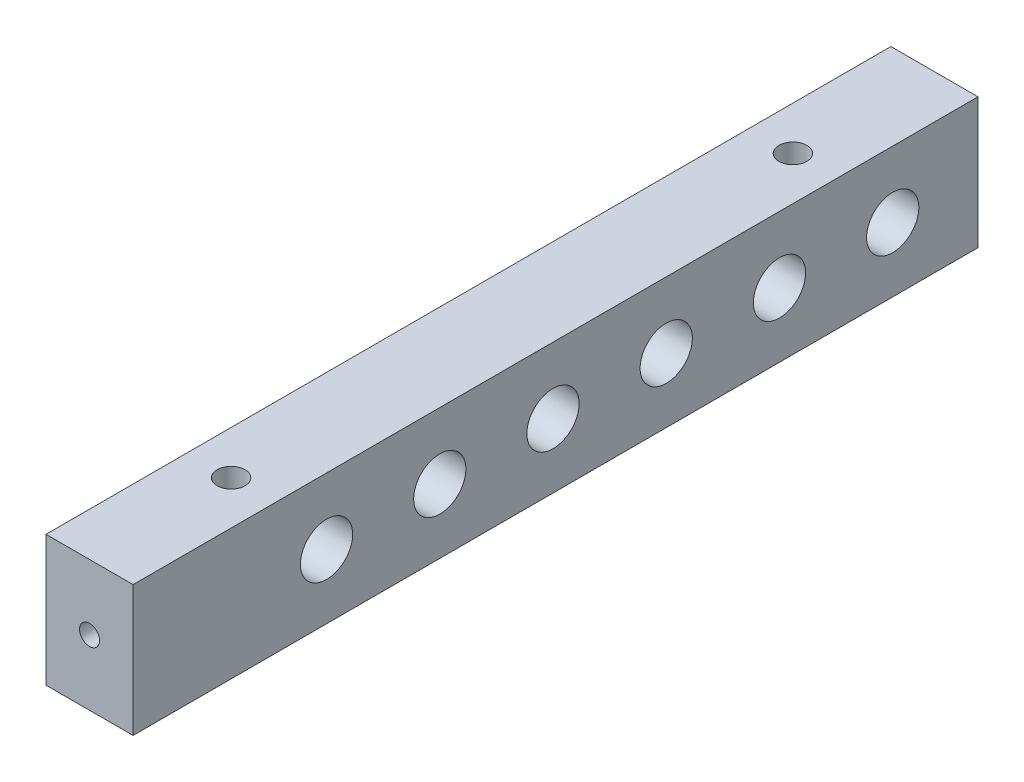
ISO-10303-21;
HEADER;
FILE_DESCRIPTION(('STEP AP214'),'2;1');
FILE_NAME('part.step','',(''),(''),'','','');
FILE_SCHEMA(('AUTOMOTIVE_DESIGN { 1 0 10303 214 1 1 1 1 }'));
ENDSEC;
DATA;
#1=APPLICATION_CONTEXT('core data for automotive mechanical design processes');
#2=APPLICATION_PROTOCOL_DEFINITION('international standard','automotive_design',2000,#1);
#3=PRODUCT_CONTEXT('',#1,'mechanical');
#4=PRODUCT('Part','Part','',(#3));
#5=PRODUCT_RELATED_PRODUCT_CATEGORY('part','',(#4));
#6=PRODUCT_DEFINITION_FORMATION('','',#4);
#7=PRODUCT_DEFINITION_CONTEXT('part definition',#1,'design');
#8=PRODUCT_DEFINITION('design','',#6,#7);
#9=PRODUCT_DEFINITION_SHAPE('','',#8);
#10=(LENGTH_UNIT() NAMED_UNIT(*) SI_UNIT(.MILLI.,.METRE.));
#11=(NAMED_UNIT(*) PLANE_ANGLE_UNIT() SI_UNIT($,.RADIAN.));
#12=(NAMED_UNIT(*) SI_UNIT($,.STERADIAN.) SOLID_ANGLE_UNIT());
#13=UNCERTAINTY_MEASURE_WITH_UNIT(LENGTH_MEASURE(1.E-05),#10,'distance_accuracy_value','');
#14=(GEOMETRIC_REPRESENTATION_CONTEXT(3) GLOBAL_UNCERTAINTY_ASSIGNED_CONTEXT((#13)) GLOBAL_UNIT_ASSIGNED_CONTEXT((#10,
#11,#12)) REPRESENTATION_CONTEXT('',''));
#15=CARTESIAN_POINT('',(0.,0.,0.));
#16=DIRECTION('',(0.,0.,1.));
#17=DIRECTION('',(1.,0.,0.));
#18=AXIS2_PLACEMENT_3D('',#15,#16,#17);
#19=CARTESIAN_POINT('',(5.34883720934921,-6.77325581395348,33.7500000001497));
#20=DIRECTION('',(0.,1.,0.));
#21=DIRECTION('',(0.,0.,1.));
#22=AXIS2_PLACEMENT_3D('',#19,#20,#21);
#23=CYLINDRICAL_SURFACE('',#22,1.6);
#24=CARTESIAN_POINT('',(5.34883720934921,8.22674418604652,33.7500000001497));
#25=DIRECTION('',(0.,1.,0.));
#26=DIRECTION('',(0.,0.,1.));
#27=AXIS2_PLACEMENT_3D('',#24,#25,#26);
#28=CIRCLE('',#27,1.6);
#29=CARTESIAN_POINT('',(5.34883720934921,8.22674418604652,35.3500000001497));
#30=VERTEX_POINT('',#29);
#31=EDGE_CURVE('E101',#30,#30,#28,.T.);
#32=ORIENTED_EDGE('',*,*,#31,.T.);
#33=EDGE_LOOP('',(#32));
#34=FACE_BOUND('',#33,.T.);
#35=CARTESIAN_POINT('',(5.34883720934921,-3.77325581395348,33.7500000001497));
#36=DIRECTION('',(0.,-1.,0.));
#37=DIRECTION('',(0.,0.,-1.));
#38=AXIS2_PLACEMENT_3D('',#35,#36,#37);
#39=CIRCLE('',#38,1.6);
#40=CARTESIAN_POINT('',(5.34883720934921,-3.77325581395348,32.1500000001497));
#41=VERTEX_POINT('',#40);
#42=EDGE_CURVE('E40',#41,#41,#39,.F.);
#43=ORIENTED_EDGE('',*,*,#42,.F.);
#44=EDGE_LOOP('',(#43));
#45=FACE_BOUND('',#44,.T.);
#46=ADVANCED_FACE('F36',(#34,#45),#23,.F.);
#47=CARTESIAN_POINT('',(5.34883720934917,-6.77325581395348,-30.7499999998503));
#48=DIRECTION('',(0.,1.,0.));
#49=DIRECTION('',(0.,0.,1.));
#50=AXIS2_PLACEMENT_3D('',#47,#48,#49);
#51=CYLINDRICAL_SURFACE('',#50,1.6);
#52=CARTESIAN_POINT('',(5.34883720934917,8.22674418604652,-30.7499999998503));
#53=DIRECTION('',(0.,1.,0.));
#54=DIRECTION('',(0.,0.,1.));
#55=AXIS2_PLACEMENT_3D('',#52,#53,#54);
#56=CIRCLE('',#55,1.6);
#57=CARTESIAN_POINT('',(5.34883720934917,8.22674418604652,-29.1499999998503));
#58=VERTEX_POINT('',#57);
#59=EDGE_CURVE('E98',#58,#58,#56,.T.);
#60=ORIENTED_EDGE('',*,*,#59,.T.);
#61=EDGE_LOOP('',(#60));
#62=FACE_BOUND('',#61,.T.);
#63=CARTESIAN_POINT('',(5.34883720934917,-3.77325581395348,-30.7499999998503));
#64=DIRECTION('',(0.,-1.,0.));
#65=DIRECTION('',(0.,0.,-1.));
#66=AXIS2_PLACEMENT_3D('',#63,#64,#65);
#67=CIRCLE('',#66,1.6);
#68=CARTESIAN_POINT('',(5.34883720934917,-3.77325581395348,-32.3499999998503));
#69=VERTEX_POINT('',#68);
#70=EDGE_CURVE('E113',#69,#69,#67,.F.);
#71=ORIENTED_EDGE('',*,*,#70,.F.);
#72=EDGE_LOOP('',(#71));
#73=FACE_BOUND('',#72,.T.);
#74=ADVANCED_FACE('F157',(#62,#73),#51,.F.);
#75=CARTESIAN_POINT('',(0.348837209302328,8.22674418604652,50.));
#76=DIRECTION('',(1.,0.,0.));
#77=DIRECTION('',(0.,1.,0.));
#78=AXIS2_PLACEMENT_3D('',#75,#76,#77);
#79=PLANE('',#78);
#80=CARTESIAN_POINT('',(0.348837209302326,0.629031613050483,27.7929524722907));
#81=DIRECTION('',(-1.,0.,0.));
#82=DIRECTION('',(0.,0.,1.));
#83=AXIS2_PLACEMENT_3D('',#80,#81,#82);
#84=CIRCLE('',#83,3.);
#85=CARTESIAN_POINT('',(0.348837209302326,0.629031613050483,30.7929524722907));
#86=VERTEX_POINT('',#85);
#87=EDGE_CURVE('E220',#86,#86,#84,.T.);
#88=ORIENTED_EDGE('',*,*,#87,.F.);
#89=EDGE_LOOP('',(#88));
#90=FACE_BOUND('',#89,.T.);
#91=CARTESIAN_POINT('',(0.348837209302327,0.629031613050392,14.7929524722907));
#92=DIRECTION('',(-1.,0.,0.));
#93=DIRECTION('',(0.,0.,1.));
#94=AXIS2_PLACEMENT_3D('',#91,#92,#93);
#95=CIRCLE('',#94,3.);
#96=CARTESIAN_POINT('',(0.348837209302327,0.629031613050392,17.7929524722907));
#97=VERTEX_POINT('',#96);
#98=EDGE_CURVE('E226',#97,#97,#95,.T.);
#99=ORIENTED_EDGE('',*,*,#98,.F.);
#100=EDGE_LOOP('',(#99));
#101=FACE_BOUND('',#100,.T.);
#102=CARTESIAN_POINT('',(0.348837209302327,0.629031613050301,1.79295247229073));
#103=DIRECTION('',(-1.,0.,0.));
#104=DIRECTION('',(0.,0.,1.));
#105=AXIS2_PLACEMENT_3D('',#102,#103,#104);
#106=CIRCLE('',#105,3.);
#107=CARTESIAN_POINT('',(0.348837209302327,0.629031613050301,4.79295247229073));
#108=VERTEX_POINT('',#107);
#109=EDGE_CURVE('E232',#108,#108,#106,.T.);
#110=ORIENTED_EDGE('',*,*,#109,.F.);
#111=EDGE_LOOP('',(#110));
#112=FACE_BOUND('',#111,.T.);
#113=CARTESIAN_POINT('',(0.348837209302327,0.629031613050211,-11.2070475277093));
#114=DIRECTION('',(-1.,0.,0.));
#115=DIRECTION('',(0.,0.,1.));
#116=AXIS2_PLACEMENT_3D('',#113,#114,#115);
#117=CIRCLE('',#116,3.);
#118=CARTESIAN_POINT('',(0.348837209302327,0.629031613050211,-8.20704752770927));
#119=VERTEX_POINT('',#118);
#120=EDGE_CURVE('E238',#119,#119,#117,.T.);
#121=ORIENTED_EDGE('',*,*,#120,.F.);
#122=EDGE_LOOP('',(#121));
#123=FACE_BOUND('',#122,.T.);
#124=CARTESIAN_POINT('',(0.348837209302327,0.62903161305012,-24.2070475277093));
#125=DIRECTION('',(-1.,0.,0.));
#126=DIRECTION('',(0.,0.,1.));
#127=AXIS2_PLACEMENT_3D('',#124,#125,#126);
#128=CIRCLE('',#127,3.);
#129=CARTESIAN_POINT('',(0.348837209302327,0.62903161305012,-21.2070475277093));
#130=VERTEX_POINT('',#129);
#131=EDGE_CURVE('E244',#130,#130,#128,.T.);
#132=ORIENTED_EDGE('',*,*,#131,.F.);
#133=EDGE_LOOP('',(#132));
#134=FACE_BOUND('',#133,.T.);
#135=CARTESIAN_POINT('',(0.348837209302327,0.629031613050029,-37.2070475277093));
#136=DIRECTION('',(-1.,0.,0.));
#137=DIRECTION('',(0.,0.,1.));
#138=AXIS2_PLACEMENT_3D('',#135,#136,#137);
#139=CIRCLE('',#138,3.);
#140=CARTESIAN_POINT('',(0.348837209302327,0.629031613050029,-34.2070475277093));
#141=VERTEX_POINT('',#140);
#142=EDGE_CURVE('E250',#141,#141,#139,.T.);
#143=ORIENTED_EDGE('',*,*,#142,.F.);
#144=EDGE_LOOP('',(#143));
#145=FACE_BOUND('',#144,.T.);
#146=DIRECTION('',(0.,0.,-1.));
#147=VECTOR('',#146,1.);
#148=CARTESIAN_POINT('',(0.348837209302328,8.22674418604652,50.));
#149=LINE('',#148,#147);
#150=CARTESIAN_POINT('',(0.348837209302328,8.22674418604652,50.));
#151=VERTEX_POINT('',#150);
#152=CARTESIAN_POINT('',(0.34883720930233,8.22674418604652,-46.9999999998503));
#153=VERTEX_POINT('',#152);
#154=EDGE_CURVE('E78',#151,#153,#149,.T.);
#155=ORIENTED_EDGE('',*,*,#154,.T.);
#156=DIRECTION('',(0.,-1.,0.));
#157=VECTOR('',#156,1.);
#158=CARTESIAN_POINT('',(0.34883720930233,8.22674418604652,-46.9999999998503));
#159=LINE('',#158,#157);
#160=CARTESIAN_POINT('',(0.34883720930233,-6.77325581395348,-46.9999999998503));
#161=VERTEX_POINT('',#160);
#162=EDGE_CURVE('E81',#153,#161,#159,.T.);
#163=ORIENTED_EDGE('',*,*,#162,.T.);
#164=DIRECTION('',(0.,0.,-1.));
#165=VECTOR('',#164,1.);
#166=CARTESIAN_POINT('',(0.34883720930233,-6.77325581395348,50.));
#167=LINE('',#166,#165);
#168=CARTESIAN_POINT('',(0.34883720930233,-6.77325581395348,50.));
#169=VERTEX_POINT('',#168);
#170=EDGE_CURVE('E11',#169,#161,#167,.T.);
#171=ORIENTED_EDGE('',*,*,#170,.F.);
#172=DIRECTION('',(0.,-1.,0.));
#173=VECTOR('',#172,1.);
#174=CARTESIAN_POINT('',(0.348837209302328,8.22674418604652,50.));
#175=LINE('',#174,#173);
#176=EDGE_CURVE('E82',#151,#169,#175,.T.);
#177=ORIENTED_EDGE('',*,*,#176,.F.);
#178=EDGE_LOOP('',(#155,#163,#171,#177));
#179=FACE_BOUND('',#178,.T.);
#180=ADVANCED_FACE('F38',(#90,#101,#112,#123,#134,#145,#179),#79,.F.);
#181=CARTESIAN_POINT('',(0.34883720930233,-6.77325581395348,50.));
#182=DIRECTION('',(0.,1.,0.));
#183=DIRECTION('',(0.,0.,1.));
#184=AXIS2_PLACEMENT_3D('',#181,#182,#183);
#185=PLANE('',#184);
#186=CARTESIAN_POINT('',(5.34883720934917,-6.77325581395348,-30.7499999998503));
#187=DIRECTION('',(0.,-1.,0.));
#188=DIRECTION('',(0.,0.,-1.));
#189=AXIS2_PLACEMENT_3D('',#186,#187,#188);
#190=CIRCLE('',#189,3.);
#191=CARTESIAN_POINT('',(5.34883720934917,-6.77325581395348,-33.7499999998503));
#192=VERTEX_POINT('',#191);
#193=EDGE_CURVE('E120',#192,#192,#190,.T.);
#194=ORIENTED_EDGE('',*,*,#193,.F.);
#195=EDGE_LOOP('',(#194));
#196=FACE_BOUND('',#195,.T.);
#197=CARTESIAN_POINT('',(5.34883720934921,-6.77325581395348,33.7500000001497));
#198=DIRECTION('',(0.,-1.,0.));
#199=DIRECTION('',(0.,0.,-1.));
#200=AXIS2_PLACEMENT_3D('',#197,#198,#199);
#201=CIRCLE('',#200,3.);
#202=CARTESIAN_POINT('',(5.34883720934921,-6.77325581395348,30.7500000001497));
#203=VERTEX_POINT('',#202);
#204=EDGE_CURVE('E133',#203,#203,#201,.T.);
#205=ORIENTED_EDGE('',*,*,#204,.F.);
#206=EDGE_LOOP('',(#205));
#207=FACE_BOUND('',#206,.T.);
#208=ORIENTED_EDGE('',*,*,#170,.T.);
#209=DIRECTION('',(1.,0.,0.));
#210=VECTOR('',#209,1.);
#211=CARTESIAN_POINT('',(10.3488372093023,-6.77325581395348,-46.9999999998503));
#212=LINE('',#211,#210);
#213=CARTESIAN_POINT('',(10.3488372093023,-6.77325581395348,-46.9999999998503));
#214=VERTEX_POINT('',#213);
#215=EDGE_CURVE('E95',#161,#214,#212,.T.);
#216=ORIENTED_EDGE('',*,*,#215,.T.);
#217=DIRECTION('',(0.,0.,-1.));
#218=VECTOR('',#217,1.);
#219=CARTESIAN_POINT('',(10.3488372093023,-6.77325581395348,50.));
#220=LINE('',#219,#218);
#221=CARTESIAN_POINT('',(10.3488372093023,-6.77325581395348,50.));
#222=VERTEX_POINT('',#221);
#223=EDGE_CURVE('E45',#222,#214,#220,.T.);
#224=ORIENTED_EDGE('',*,*,#223,.F.);
#225=DIRECTION('',(1.,0.,0.));
#226=VECTOR('',#225,1.);
#227=CARTESIAN_POINT('',(0.34883720930233,-6.77325581395348,50.));
#228=LINE('',#227,#226);
#229=EDGE_CURVE('E108',#169,#222,#228,.T.);
#230=ORIENTED_EDGE('',*,*,#229,.F.);
#231=EDGE_LOOP('',(#208,#216,#224,#230));
#232=FACE_BOUND('',#231,.T.);
#233=ADVANCED_FACE('F142',(#196,#207,#232),#185,.F.);
#234=CARTESIAN_POINT('',(10.3488372093023,8.22674418604652,50.));
#235=DIRECTION('',(-1.,0.,0.));
#236=DIRECTION('',(0.,-1.,0.));
#237=AXIS2_PLACEMENT_3D('',#234,#235,#236);
#238=PLANE('',#237);
#239=CARTESIAN_POINT('',(10.3488372093023,0.629031613050483,27.7929524722907));
#240=DIRECTION('',(-1.,0.,0.));
#241=DIRECTION('',(0.,0.,1.));
#242=AXIS2_PLACEMENT_3D('',#239,#240,#241);
#243=CIRCLE('',#242,3.);
#244=CARTESIAN_POINT('',(10.3488372093023,0.629031613050483,30.7929524722907));
#245=VERTEX_POINT('',#244);
#246=EDGE_CURVE('E217',#245,#245,#243,.T.);
#247=ORIENTED_EDGE('',*,*,#246,.T.);
#248=EDGE_LOOP('',(#247));
#249=FACE_BOUND('',#248,.T.);
#250=CARTESIAN_POINT('',(10.3488372093023,0.629031613050392,14.7929524722907));
#251=DIRECTION('',(-1.,0.,0.));
#252=DIRECTION('',(0.,0.,1.));
#253=AXIS2_PLACEMENT_3D('',#250,#251,#252);
#254=CIRCLE('',#253,3.);
#255=CARTESIAN_POINT('',(10.3488372093023,0.629031613050392,17.7929524722907));
#256=VERTEX_POINT('',#255);
#257=EDGE_CURVE('E222',#256,#256,#254,.T.);
#258=ORIENTED_EDGE('',*,*,#257,.T.);
#259=EDGE_LOOP('',(#258));
#260=FACE_BOUND('',#259,.T.);
#261=CARTESIAN_POINT('',(10.3488372093023,0.629031613050301,1.79295247229073));
#262=DIRECTION('',(-1.,0.,0.));
#263=DIRECTION('',(0.,0.,1.));
#264=AXIS2_PLACEMENT_3D('',#261,#262,#263);
#265=CIRCLE('',#264,3.);
#266=CARTESIAN_POINT('',(10.3488372093023,0.629031613050301,4.79295247229073));
#267=VERTEX_POINT('',#266);
#268=EDGE_CURVE('E230',#267,#267,#265,.T.);
#269=ORIENTED_EDGE('',*,*,#268,.T.);
#270=EDGE_LOOP('',(#269));
#271=FACE_BOUND('',#270,.T.);
#272=CARTESIAN_POINT('',(10.3488372093023,0.629031613050211,-11.2070475277093));
#273=DIRECTION('',(-1.,0.,0.));
#274=DIRECTION('',(0.,0.,1.));
#275=AXIS2_PLACEMENT_3D('',#272,#273,#274);
#276=CIRCLE('',#275,3.);
#277=CARTESIAN_POINT('',(10.3488372093023,0.629031613050211,-8.20704752770927));
#278=VERTEX_POINT('',#277);
#279=EDGE_CURVE('E235',#278,#278,#276,.T.);
#280=ORIENTED_EDGE('',*,*,#279,.T.);
#281=EDGE_LOOP('',(#280));
#282=FACE_BOUND('',#281,.T.);
#283=CARTESIAN_POINT('',(10.3488372093023,0.62903161305012,-24.2070475277093));
#284=DIRECTION('',(-1.,0.,0.));
#285=DIRECTION('',(0.,0.,1.));
#286=AXIS2_PLACEMENT_3D('',#283,#284,#285);
#287=CIRCLE('',#286,3.);
#288=CARTESIAN_POINT('',(10.3488372093023,0.62903161305012,-21.2070475277093));
#289=VERTEX_POINT('',#288);
#290=EDGE_CURVE('E241',#289,#289,#287,.T.);
#291=ORIENTED_EDGE('',*,*,#290,.T.);
#292=EDGE_LOOP('',(#291));
#293=FACE_BOUND('',#292,.T.);
#294=CARTESIAN_POINT('',(10.3488372093023,0.629031613050029,-37.2070475277093));
#295=DIRECTION('',(-1.,0.,0.));
#296=DIRECTION('',(0.,0.,1.));
#297=AXIS2_PLACEMENT_3D('',#294,#295,#296);
#298=CIRCLE('',#297,3.);
#299=CARTESIAN_POINT('',(10.3488372093023,0.629031613050029,-34.2070475277093));
#300=VERTEX_POINT('',#299);
#301=EDGE_CURVE('E247',#300,#300,#298,.T.);
#302=ORIENTED_EDGE('',*,*,#301,.T.);
#303=EDGE_LOOP('',(#302));
#304=FACE_BOUND('',#303,.T.);
#305=ORIENTED_EDGE('',*,*,#223,.T.);
#306=DIRECTION('',(0.,1.,0.));
#307=VECTOR('',#306,1.);
#308=CARTESIAN_POINT('',(10.3488372093023,8.22674418604652,-46.9999999998503));
#309=LINE('',#308,#307);
#310=CARTESIAN_POINT('',(10.3488372093023,8.22674418604652,-46.9999999998503));
#311=VERTEX_POINT('',#310);
#312=EDGE_CURVE('E105',#214,#311,#309,.T.);
#313=ORIENTED_EDGE('',*,*,#312,.T.);
#314=DIRECTION('',(0.,0.,-1.));
#315=VECTOR('',#314,1.);
#316=CARTESIAN_POINT('',(10.3488372093023,8.22674418604652,50.));
#317=LINE('',#316,#315);
#318=CARTESIAN_POINT('',(10.3488372093023,8.22674418604652,50.));
#319=VERTEX_POINT('',#318);
#320=EDGE_CURVE('E85',#319,#311,#317,.T.);
#321=ORIENTED_EDGE('',*,*,#320,.F.);
#322=DIRECTION('',(0.,1.,0.));
#323=VECTOR('',#322,1.);
#324=CARTESIAN_POINT('',(10.3488372093023,8.22674418604652,50.));
#325=LINE('',#324,#323);
#326=EDGE_CURVE('E58',#222,#319,#325,.T.);
#327=ORIENTED_EDGE('',*,*,#326,.F.);
#328=EDGE_LOOP('',(#305,#313,#321,#327));
#329=FACE_BOUND('',#328,.T.);
#330=ADVANCED_FACE('F141',(#249,#260,#271,#282,#293,#304,#329),#238,.F.);
#331=CARTESIAN_POINT('',(0.348837209302328,8.22674418604652,50.));
#332=DIRECTION('',(0.,-1.,0.));
#333=DIRECTION('',(0.,0.,-1.));
#334=AXIS2_PLACEMENT_3D('',#331,#332,#333);
#335=PLANE('',#334);
#336=ORIENTED_EDGE('',*,*,#59,.F.);
#337=EDGE_LOOP('',(#336));
#338=FACE_BOUND('',#337,.T.);
#339=ORIENTED_EDGE('',*,*,#31,.F.);
#340=EDGE_LOOP('',(#339));
#341=FACE_BOUND('',#340,.T.);
#342=ORIENTED_EDGE('',*,*,#320,.T.);
#343=DIRECTION('',(-1.,0.,0.));
#344=VECTOR('',#343,1.);
#345=CARTESIAN_POINT('',(10.3488372093023,8.22674418604652,-46.9999999998503));
#346=LINE('',#345,#344);
#347=EDGE_CURVE('E92',#311,#153,#346,.T.);
#348=ORIENTED_EDGE('',*,*,#347,.T.);
#349=ORIENTED_EDGE('',*,*,#154,.F.);
#350=DIRECTION('',(-1.,0.,0.));
#351=VECTOR('',#350,1.);
#352=CARTESIAN_POINT('',(0.348837209302328,8.22674418604652,50.));
#353=LINE('',#352,#351);
#354=EDGE_CURVE('E53',#319,#151,#353,.T.);
#355=ORIENTED_EDGE('',*,*,#354,.F.);
#356=EDGE_LOOP('',(#342,#348,#349,#355));
#357=FACE_BOUND('',#356,.T.);
#358=ADVANCED_FACE('F97',(#338,#341,#357),#335,.F.);
#359=CARTESIAN_POINT('',(0.,0.,50.));
#360=DIRECTION('',(0.,0.,1.));
#361=DIRECTION('',(1.,0.,0.));
#362=AXIS2_PLACEMENT_3D('',#359,#360,#361);
#363=PLANE('',#362);
#364=CARTESIAN_POINT('',(5.34883720930233,0.726744186046516,50.));
#365=DIRECTION('',(0.,0.,1.));
#366=DIRECTION('',(1.,0.,0.));
#367=AXIS2_PLACEMENT_3D('',#364,#365,#366);
#368=CIRCLE('',#367,1.15);
#369=CARTESIAN_POINT('',(6.49883720930233,0.726744186046516,50.));
#370=VERTEX_POINT('',#369);
#371=EDGE_CURVE('E128',#370,#370,#368,.T.);
#372=ORIENTED_EDGE('',*,*,#371,.F.);
#373=EDGE_LOOP('',(#372));
#374=FACE_BOUND('',#373,.T.);
#375=ORIENTED_EDGE('',*,*,#176,.T.);
#376=ORIENTED_EDGE('',*,*,#229,.T.);
#377=ORIENTED_EDGE('',*,*,#326,.T.);
#378=ORIENTED_EDGE('',*,*,#354,.T.);
#379=EDGE_LOOP('',(#375,#376,#377,#378));
#380=FACE_BOUND('',#379,.T.);
#381=ADVANCED_FACE('F143',(#374,#380),#363,.T.);
#382=CARTESIAN_POINT('',(-176.851162790651,9.47674418604075,-46.9999999998503));
#383=DIRECTION('',(0.,0.,1.));
#384=DIRECTION('',(1.,0.,0.));
#385=AXIS2_PLACEMENT_3D('',#382,#383,#384);
#386=PLANE('',#385);
#387=ORIENTED_EDGE('',*,*,#215,.F.);
#388=ORIENTED_EDGE('',*,*,#162,.F.);
#389=ORIENTED_EDGE('',*,*,#347,.F.);
#390=ORIENTED_EDGE('',*,*,#312,.F.);
#391=EDGE_LOOP('',(#387,#388,#389,#390));
#392=FACE_BOUND('',#391,.T.);
#393=ADVANCED_FACE('F90',(#392),#386,.F.);
#394=CARTESIAN_POINT('',(5.34883720934917,-3.77325581395348,-30.7499999998503));
#395=DIRECTION('',(0.,-1.,0.));
#396=DIRECTION('',(0.,0.,-1.));
#397=AXIS2_PLACEMENT_3D('',#394,#395,#396);
#398=PLANE('',#397);
#399=CARTESIAN_POINT('',(5.34883720934917,-3.77325581395348,-30.7499999998503));
#400=DIRECTION('',(0.,-1.,0.));
#401=DIRECTION('',(0.,0.,-1.));
#402=AXIS2_PLACEMENT_3D('',#399,#400,#401);
#403=CIRCLE('',#402,3.);
#404=CARTESIAN_POINT('',(5.34883720934917,-3.77325581395348,-33.7499999998503));
#405=VERTEX_POINT('',#404);
#406=EDGE_CURVE('E115',#405,#405,#403,.T.);
#407=ORIENTED_EDGE('',*,*,#406,.T.);
#408=EDGE_LOOP('',(#407));
#409=FACE_BOUND('',#408,.T.);
#410=ORIENTED_EDGE('',*,*,#70,.T.);
#411=EDGE_LOOP('',(#410));
#412=FACE_BOUND('',#411,.T.);
#413=ADVANCED_FACE('F151',(#409,#412),#398,.T.);
#414=CARTESIAN_POINT('',(5.34883720934917,-3.77325581395348,-30.7499999998503));
#415=DIRECTION('',(0.,-1.,0.));
#416=DIRECTION('',(0.,0.,-1.));
#417=AXIS2_PLACEMENT_3D('',#414,#415,#416);
#418=CYLINDRICAL_SURFACE('',#417,3.);
#419=ORIENTED_EDGE('',*,*,#406,.F.);
#420=EDGE_LOOP('',(#419));
#421=FACE_BOUND('',#420,.T.);
#422=ORIENTED_EDGE('',*,*,#193,.T.);
#423=EDGE_LOOP('',(#422));
#424=FACE_BOUND('',#423,.T.);
#425=ADVANCED_FACE('F175',(#421,#424),#418,.F.);
#426=CARTESIAN_POINT('',(5.34883720934921,-3.77325581395348,33.7500000001497));
#427=DIRECTION('',(0.,-1.,0.));
#428=DIRECTION('',(0.,0.,-1.));
#429=AXIS2_PLACEMENT_3D('',#426,#427,#428);
#430=PLANE('',#429);
#431=CARTESIAN_POINT('',(5.34883720934921,-3.77325581395348,33.7500000001497));
#432=DIRECTION('',(0.,-1.,0.));
#433=DIRECTION('',(0.,0.,-1.));
#434=AXIS2_PLACEMENT_3D('',#431,#432,#433);
#435=CIRCLE('',#434,3.);
#436=CARTESIAN_POINT('',(5.34883720934921,-3.77325581395348,30.7500000001497));
#437=VERTEX_POINT('',#436);
#438=EDGE_CURVE('E125',#437,#437,#435,.T.);
#439=ORIENTED_EDGE('',*,*,#438,.T.);
#440=EDGE_LOOP('',(#439));
#441=FACE_BOUND('',#440,.T.);
#442=ORIENTED_EDGE('',*,*,#42,.T.);
#443=EDGE_LOOP('',(#442));
#444=FACE_BOUND('',#443,.T.);
#445=ADVANCED_FACE('F171',(#441,#444),#430,.T.);
#446=CARTESIAN_POINT('',(5.34883720934921,-3.77325581395348,33.7500000001497));
#447=DIRECTION('',(0.,-1.,0.));
#448=DIRECTION('',(0.,0.,-1.));
#449=AXIS2_PLACEMENT_3D('',#446,#447,#448);
#450=CYLINDRICAL_SURFACE('',#449,3.);
#451=ORIENTED_EDGE('',*,*,#438,.F.);
#452=EDGE_LOOP('',(#451));
#453=FACE_BOUND('',#452,.T.);
#454=ORIENTED_EDGE('',*,*,#204,.T.);
#455=EDGE_LOOP('',(#454));
#456=FACE_BOUND('',#455,.T.);
#457=ADVANCED_FACE('F167',(#453,#456),#450,.F.);
#458=CARTESIAN_POINT('',(5.34883720930233,0.726744186046516,40.));
#459=DIRECTION('',(0.,0.,1.));
#460=DIRECTION('',(1.,0.,0.));
#461=AXIS2_PLACEMENT_3D('',#458,#459,#460);
#462=CYLINDRICAL_SURFACE('',#461,1.15);
#463=CARTESIAN_POINT('',(5.34883720930233,0.726744186046516,40.));
#464=DIRECTION('',(0.,0.,1.));
#465=DIRECTION('',(1.,0.,0.));
#466=AXIS2_PLACEMENT_3D('',#463,#464,#465);
#467=CIRCLE('',#466,1.15);
#468=CARTESIAN_POINT('',(6.49883720930233,0.726744186046516,40.));
#469=VERTEX_POINT('',#468);
#470=EDGE_CURVE('E135',#469,#469,#467,.T.);
#471=ORIENTED_EDGE('',*,*,#470,.F.);
#472=EDGE_LOOP('',(#471));
#473=FACE_BOUND('',#472,.T.);
#474=ORIENTED_EDGE('',*,*,#371,.T.);
#475=EDGE_LOOP('',(#474));
#476=FACE_BOUND('',#475,.T.);
#477=ADVANCED_FACE('F170',(#473,#476),#462,.F.);
#478=CARTESIAN_POINT('',(5.34883720930233,0.726744186046516,40.));
#479=DIRECTION('',(0.,0.,1.));
#480=DIRECTION('',(1.,0.,0.));
#481=AXIS2_PLACEMENT_3D('',#478,#479,#480);
#482=PLANE('',#481);
#483=ORIENTED_EDGE('',*,*,#470,.T.);
#484=EDGE_LOOP('',(#483));
#485=FACE_BOUND('',#484,.T.);
#486=ADVANCED_FACE('F184',(#485),#482,.T.);
#487=CARTESIAN_POINT('',(10.3488372093023,0.629031613050029,-37.2070475277093));
#488=DIRECTION('',(-1.,0.,0.));
#489=DIRECTION('',(0.,0.,1.));
#490=AXIS2_PLACEMENT_3D('',#487,#488,#489);
#491=CYLINDRICAL_SURFACE('',#490,3.);
#492=ORIENTED_EDGE('',*,*,#301,.F.);
#493=EDGE_LOOP('',(#492));
#494=FACE_BOUND('',#493,.T.);
#495=ORIENTED_EDGE('',*,*,#142,.T.);
#496=EDGE_LOOP('',(#495));
#497=FACE_BOUND('',#496,.T.);
#498=ADVANCED_FACE('F188',(#494,#497),#491,.F.);
#499=CARTESIAN_POINT('',(10.3488372093023,0.62903161305012,-24.2070475277093));
#500=DIRECTION('',(-1.,0.,0.));
#501=DIRECTION('',(0.,0.,1.));
#502=AXIS2_PLACEMENT_3D('',#499,#500,#501);
#503=CYLINDRICAL_SURFACE('',#502,3.);
#504=ORIENTED_EDGE('',*,*,#290,.F.);
#505=EDGE_LOOP('',(#504));
#506=FACE_BOUND('',#505,.T.);
#507=ORIENTED_EDGE('',*,*,#131,.T.);
#508=EDGE_LOOP('',(#507));
#509=FACE_BOUND('',#508,.T.);
#510=ADVANCED_FACE('F192',(#506,#509),#503,.F.);
#511=CARTESIAN_POINT('',(10.3488372093023,0.629031613050211,-11.2070475277093));
#512=DIRECTION('',(-1.,0.,0.));
#513=DIRECTION('',(0.,0.,1.));
#514=AXIS2_PLACEMENT_3D('',#511,#512,#513);
#515=CYLINDRICAL_SURFACE('',#514,3.);
#516=ORIENTED_EDGE('',*,*,#279,.F.);
#517=EDGE_LOOP('',(#516));
#518=FACE_BOUND('',#517,.T.);
#519=ORIENTED_EDGE('',*,*,#120,.T.);
#520=EDGE_LOOP('',(#519));
#521=FACE_BOUND('',#520,.T.);
#522=ADVANCED_FACE('F196',(#518,#521),#515,.F.);
#523=CARTESIAN_POINT('',(10.3488372093023,0.629031613050301,1.79295247229073));
#524=DIRECTION('',(-1.,0.,0.));
#525=DIRECTION('',(0.,0.,1.));
#526=AXIS2_PLACEMENT_3D('',#523,#524,#525);
#527=CYLINDRICAL_SURFACE('',#526,3.);
#528=ORIENTED_EDGE('',*,*,#268,.F.);
#529=EDGE_LOOP('',(#528));
#530=FACE_BOUND('',#529,.T.);
#531=ORIENTED_EDGE('',*,*,#109,.T.);
#532=EDGE_LOOP('',(#531));
#533=FACE_BOUND('',#532,.T.);
#534=ADVANCED_FACE('F200',(#530,#533),#527,.F.);
#535=CARTESIAN_POINT('',(10.3488372093023,0.629031613050392,14.7929524722907));
#536=DIRECTION('',(-1.,0.,0.));
#537=DIRECTION('',(0.,0.,1.));
#538=AXIS2_PLACEMENT_3D('',#535,#536,#537);
#539=CYLINDRICAL_SURFACE('',#538,3.);
#540=ORIENTED_EDGE('',*,*,#257,.F.);
#541=EDGE_LOOP('',(#540));
#542=FACE_BOUND('',#541,.T.);
#543=ORIENTED_EDGE('',*,*,#98,.T.);
#544=EDGE_LOOP('',(#543));
#545=FACE_BOUND('',#544,.T.);
#546=ADVANCED_FACE('F204',(#542,#545),#539,.F.);
#547=CARTESIAN_POINT('',(10.3488372093023,0.629031613050483,27.7929524722907));
#548=DIRECTION('',(-1.,0.,0.));
#549=DIRECTION('',(0.,0.,1.));
#550=AXIS2_PLACEMENT_3D('',#547,#548,#549);
#551=CYLINDRICAL_SURFACE('',#550,3.);
#552=ORIENTED_EDGE('',*,*,#246,.F.);
#553=EDGE_LOOP('',(#552));
#554=FACE_BOUND('',#553,.T.);
#555=ORIENTED_EDGE('',*,*,#87,.T.);
#556=EDGE_LOOP('',(#555));
#557=FACE_BOUND('',#556,.T.);
#558=ADVANCED_FACE('F208',(#554,#557),#551,.F.);
#559=CLOSED_SHELL('',(#46,#74,#180,#233,#330,#358,#381,#393,#413,#425,#445,#457,#477,#486,#498,
#510,#522,#534,#546,#558));
#560=MANIFOLD_SOLID_BREP('B2',#559);
#561=ADVANCED_BREP_SHAPE_REPRESENTATION('',(#18,#560),#14);
#562=SHAPE_DEFINITION_REPRESENTATION(#9,#561);
ENDSEC;
END-ISO-10303-21;
